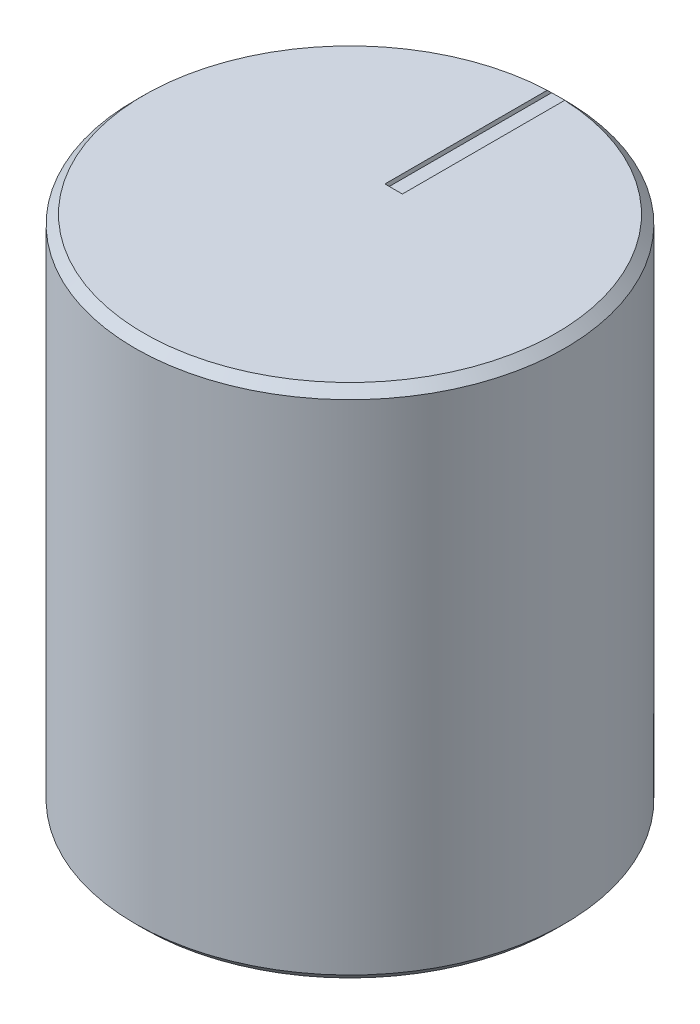
ISO-10303-21;
HEADER;
FILE_DESCRIPTION(('STEP AP214'),'2;1');
FILE_NAME('part.step','',(''),(''),'','','');
FILE_SCHEMA(('AUTOMOTIVE_DESIGN { 1 0 10303 214 1 1 1 1 }'));
ENDSEC;
DATA;
#1=APPLICATION_CONTEXT('core data for automotive mechanical design processes');
#2=APPLICATION_PROTOCOL_DEFINITION('international standard','automotive_design',2000,#1);
#3=PRODUCT_CONTEXT('',#1,'mechanical');
#4=PRODUCT('Part','Part','',(#3));
#5=PRODUCT_RELATED_PRODUCT_CATEGORY('part','',(#4));
#6=PRODUCT_DEFINITION_FORMATION('','',#4);
#7=PRODUCT_DEFINITION_CONTEXT('part definition',#1,'design');
#8=PRODUCT_DEFINITION('design','',#6,#7);
#9=PRODUCT_DEFINITION_SHAPE('','',#8);
#10=(LENGTH_UNIT() NAMED_UNIT(*) SI_UNIT(.MILLI.,.METRE.));
#11=(NAMED_UNIT(*) PLANE_ANGLE_UNIT() SI_UNIT($,.RADIAN.));
#12=(NAMED_UNIT(*) SI_UNIT($,.STERADIAN.) SOLID_ANGLE_UNIT());
#13=UNCERTAINTY_MEASURE_WITH_UNIT(LENGTH_MEASURE(1.E-05),#10,'distance_accuracy_value','');
#14=(GEOMETRIC_REPRESENTATION_CONTEXT(3) GLOBAL_UNCERTAINTY_ASSIGNED_CONTEXT((#13)) GLOBAL_UNIT_ASSIGNED_CONTEXT((#10,
#11,#12)) REPRESENTATION_CONTEXT('',''));
#15=CARTESIAN_POINT('',(0.,0.,0.));
#16=DIRECTION('',(0.,0.,1.));
#17=DIRECTION('',(1.,0.,0.));
#18=AXIS2_PLACEMENT_3D('',#15,#16,#17);
#19=CARTESIAN_POINT('',(0.,15.,0.));
#20=DIRECTION('',(0.,-1.,0.));
#21=DIRECTION('',(0.,0.,-1.));
#22=AXIS2_PLACEMENT_3D('',#19,#20,#21);
#23=CYLINDRICAL_SURFACE('',#22,6.25);
#24=CARTESIAN_POINT('',(0.,14.746,0.));
#25=DIRECTION('',(0.,1.,0.));
#26=DIRECTION('',(0.,0.,1.));
#27=AXIS2_PLACEMENT_3D('',#24,#25,#26);
#28=CIRCLE('',#27,6.25);
#29=CARTESIAN_POINT('',(0.,14.746,6.25));
#30=VERTEX_POINT('',#29);
#31=EDGE_CURVE('E111',#30,#30,#28,.F.);
#32=ORIENTED_EDGE('',*,*,#31,.T.);
#33=EDGE_LOOP('',(#32));
#34=FACE_BOUND('',#33,.T.);
#35=CARTESIAN_POINT('',(0.,0.253999999999997,0.));
#36=DIRECTION('',(0.,1.,0.));
#37=DIRECTION('',(0.,0.,1.));
#38=AXIS2_PLACEMENT_3D('',#35,#36,#37);
#39=CIRCLE('',#38,6.25);
#40=CARTESIAN_POINT('',(0.,0.253999999999997,6.25));
#41=VERTEX_POINT('',#40);
#42=EDGE_CURVE('E108',#41,#41,#39,.T.);
#43=ORIENTED_EDGE('',*,*,#42,.T.);
#44=EDGE_LOOP('',(#43));
#45=FACE_BOUND('',#44,.T.);
#46=ADVANCED_FACE('F35',(#34,#45),#23,.T.);
#47=CARTESIAN_POINT('',(0.,15.,0.));
#48=DIRECTION('',(0.,1.,0.));
#49=DIRECTION('',(0.,0.,1.));
#50=AXIS2_PLACEMENT_3D('',#47,#48,#49);
#51=PLANE('',#50);
#52=DIRECTION('',(0.,0.,1.));
#53=VECTOR('',#52,1.);
#54=CARTESIAN_POINT('',(-0.254,15.,-6.21376467680139));
#55=LINE('',#54,#53);
#56=CARTESIAN_POINT('',(-0.254,15.,-5.99061766431475));
#57=VERTEX_POINT('',#56);
#58=CARTESIAN_POINT('',(-0.253999999999999,15.,-1.27));
#59=VERTEX_POINT('',#58);
#60=EDGE_CURVE('E89',#57,#59,#55,.T.);
#61=ORIENTED_EDGE('',*,*,#60,.F.);
#62=CARTESIAN_POINT('',(0.,15.,0.));
#63=DIRECTION('',(0.,1.,0.));
#64=DIRECTION('',(0.,0.,1.));
#65=AXIS2_PLACEMENT_3D('',#62,#63,#64);
#66=CIRCLE('',#65,5.99599999999999);
#67=CARTESIAN_POINT('',(0.254,15.,-5.99061766431475));
#68=VERTEX_POINT('',#67);
#69=EDGE_CURVE('E103',#57,#68,#66,.T.);
#70=ORIENTED_EDGE('',*,*,#69,.T.);
#71=DIRECTION('',(0.,0.,-1.));
#72=VECTOR('',#71,1.);
#73=CARTESIAN_POINT('',(0.254,15.,-6.21376467680139));
#74=LINE('',#73,#72);
#75=CARTESIAN_POINT('',(0.253999999999999,15.,-1.27));
#76=VERTEX_POINT('',#75);
#77=EDGE_CURVE('E83',#76,#68,#74,.T.);
#78=ORIENTED_EDGE('',*,*,#77,.F.);
#79=DIRECTION('',(1.,0.,0.));
#80=VECTOR('',#79,1.);
#81=CARTESIAN_POINT('',(-0.253999999999999,15.,-1.27));
#82=LINE('',#81,#80);
#83=EDGE_CURVE('E100',#59,#76,#82,.T.);
#84=ORIENTED_EDGE('',*,*,#83,.F.);
#85=EDGE_LOOP('',(#61,#70,#78,#84));
#86=FACE_BOUND('',#85,.T.);
#87=ADVANCED_FACE('F135',(#86),#51,.T.);
#88=CARTESIAN_POINT('',(0.,0.,0.));
#89=DIRECTION('',(0.,1.,0.));
#90=DIRECTION('',(0.,0.,1.));
#91=AXIS2_PLACEMENT_3D('',#88,#89,#90);
#92=PLANE('',#91);
#93=CARTESIAN_POINT('',(0.,0.,0.));
#94=DIRECTION('',(0.,1.,0.));
#95=DIRECTION('',(0.,0.,1.));
#96=AXIS2_PLACEMENT_3D('',#93,#94,#95);
#97=CIRCLE('',#96,5.996);
#98=CARTESIAN_POINT('',(0.,0.,5.996));
#99=VERTEX_POINT('',#98);
#100=EDGE_CURVE('E115',#99,#99,#97,.F.);
#101=ORIENTED_EDGE('',*,*,#100,.T.);
#102=EDGE_LOOP('',(#101));
#103=FACE_BOUND('',#102,.T.);
#104=ADVANCED_FACE('F138',(#103),#92,.F.);
#105=CARTESIAN_POINT('',(0.,15.,0.));
#106=DIRECTION('',(0.,-1.,0.));
#107=DIRECTION('',(0.,0.,-1.));
#108=AXIS2_PLACEMENT_3D('',#105,#106,#107);
#109=CONICAL_SURFACE('',#108,5.99599999999999,0.785398163397445);
#110=CARTESIAN_POINT('',(-0.254000000000001,10.3369813095631,-10.6559919032947));
#111=CARTESIAN_POINT('',(-0.254000000000001,10.739421987055,-10.2534356678842));
#112=CARTESIAN_POINT('',(-0.254,11.1418573654115,-9.85087413434728));
#113=CARTESIAN_POINT('',(-0.254,11.9467090007975,-9.04573241675473));
#114=CARTESIAN_POINT('',(-0.254,12.3491252578378,-8.64315223270999));
#115=CARTESIAN_POINT('',(-0.254,13.153929949048,-7.83796533853271));
#116=CARTESIAN_POINT('',(-0.254,13.5563183832613,-7.43535862844354));
#117=CARTESIAN_POINT('',(-0.254,14.3610513824401,-6.63010091727617));
#118=CARTESIAN_POINT('',(-0.254,14.7633959473809,-6.2274499161733));
#119=CARTESIAN_POINT('',(-0.254,15.5680114430235,-5.42207179104844));
#120=CARTESIAN_POINT('',(-0.254,15.9702823734881,-5.01934466678953));
#121=CARTESIAN_POINT('',(-0.254,16.5735735323527,-4.41513964442077));
#122=CARTESIAN_POINT('',(-0.254,16.7746511966832,-4.21371909720213));
#123=CARTESIAN_POINT('',(-0.254,17.1767474166563,-3.81081868756715));
#124=CARTESIAN_POINT('',(-0.254,17.3777659722523,-3.60933882510439));
#125=CARTESIAN_POINT('',(-0.254,17.7797078514177,-3.20628176695699));
#126=CARTESIAN_POINT('',(-0.254,17.9806311744198,-3.00470457070678));
#127=CARTESIAN_POINT('',(-0.254,18.3823105245483,-2.60138438300414));
#128=CARTESIAN_POINT('',(-0.254,18.5830665520595,-2.39964139193534));
#129=CARTESIAN_POINT('',(-0.254,18.8839380800074,-2.0967641066331));
#130=CARTESIAN_POINT('',(-0.253999999999999,18.9841853214257,-1.99576072249854));
#131=CARTESIAN_POINT('',(-0.253999999999999,19.1845393893087,-1.79361520733663));
#132=CARTESIAN_POINT('',(-0.253999999999999,19.2846462160896,-1.69247307662263));
#133=CARTESIAN_POINT('',(-0.253999999999999,19.484630556733,-1.4899601118495));
#134=CARTESIAN_POINT('',(-0.253999999999999,19.5845080683389,-1.38858927555893));
#135=CARTESIAN_POINT('',(-0.253999999999999,19.7340000581108,-1.23621383378888));
#136=CARTESIAN_POINT('',(-0.253999999999999,19.7837768667688,-1.18536862493252));
#137=CARTESIAN_POINT('',(-0.253999999999999,19.8831641408086,-1.08351553215591));
#138=CARTESIAN_POINT('',(-0.253999999999999,19.9327746054859,-1.03250764754842));
#139=CARTESIAN_POINT('',(-0.253999999999999,19.9822726268755,-0.981390435566857));
#140=B_SPLINE_CURVE_WITH_KNOTS('',3,(#110,#111,#112,#113,#114,#115,#116,#117,#118,#119,#120,
#121,#122,#123,#124,#125,#126,#127,#128,#129,#130,#131,#132,#133,#134,#135,#136,#137,#138,#139),
.UNSPECIFIED.,.F.,.F.,(4,2,2,2,2,2,2,2,2,2,2,2,2,2,4),(0.,1.70765634586201,3.41531170770028,
5.12296434379059,6.83061793593988,8.53827693316711,9.39210488157586,10.2459334996874,
11.0997671402823,11.9535988107468,12.3805187765435,12.8074377797723,13.2343609665454,
13.4478242092593,13.6612883549744),.UNSPECIFIED.);
#141=CARTESIAN_POINT('',(-0.254,14.873,-6.11772939904994));
#142=VERTEX_POINT('',#141);
#143=EDGE_CURVE('E11',#142,#57,#140,.T.);
#144=ORIENTED_EDGE('',*,*,#143,.F.);
#145=CARTESIAN_POINT('',(0.,14.873,0.));
#146=DIRECTION('',(0.,1.,0.));
#147=DIRECTION('',(0.,0.,1.));
#148=AXIS2_PLACEMENT_3D('',#145,#146,#147);
#149=CIRCLE('',#148,6.12299999999999);
#150=CARTESIAN_POINT('',(0.254,14.873,-6.11772939904994));
#151=VERTEX_POINT('',#150);
#152=EDGE_CURVE('E59',#142,#151,#149,.F.);
#153=ORIENTED_EDGE('',*,*,#152,.T.);
#154=CARTESIAN_POINT('',(0.253999999999999,19.9822726268755,-0.981390435566857));
#155=CARTESIAN_POINT('',(0.253999999999999,19.9134110288118,-1.05248408349036));
#156=CARTESIAN_POINT('',(0.253999999999999,19.8443477370952,-1.12338122642925));
#157=CARTESIAN_POINT('',(0.253999999999999,19.7059409254085,-1.26490063628882));
#158=CARTESIAN_POINT('',(0.253999999999999,19.6365974074031,-1.33552290512982));
#159=CARTESIAN_POINT('',(0.253999999999999,19.428330943697,-1.54715492266712));
#160=CARTESIAN_POINT('',(0.253999999999999,19.2891709484143,-1.68793105112613));
#161=CARTESIAN_POINT('',(0.254,18.8712839556621,-2.10984151676619));
#162=CARTESIAN_POINT('',(0.254,18.5921428583856,-2.39056515189938));
#163=CARTESIAN_POINT('',(0.254,18.0335201474699,-2.95167302464992));
#164=CARTESIAN_POINT('',(0.254,17.7540385336901,-3.23205726212701));
#165=CARTESIAN_POINT('',(0.254,17.1949018586691,-3.79265801124779));
#166=CARTESIAN_POINT('',(0.254,16.9152467958404,-4.07287452130864));
#167=CARTESIAN_POINT('',(0.254,16.3558497978396,-4.6332205977661));
#168=CARTESIAN_POINT('',(0.254,16.0761078626948,-4.91335016418998));
#169=CARTESIAN_POINT('',(0.254,15.691239931008,-5.2986781202374));
#170=CARTESIAN_POINT('',(0.254,15.5861368088369,-5.40389935337185));
#171=CARTESIAN_POINT('',(0.254,15.3759242710248,-5.61433501434843));
#172=CARTESIAN_POINT('',(0.254,15.2708148554,-5.71954944220668));
#173=CARTESIAN_POINT('',(0.254,14.3610954879967,-6.63013646686346));
#174=CARTESIAN_POINT('',(0.254,13.5563483856896,-7.43537203454011));
#175=CARTESIAN_POINT('',(0.254,11.9467222934051,-9.04573005716789));
#176=CARTESIAN_POINT('',(0.254,11.1418433020037,-9.85085251069565));
#177=CARTESIAN_POINT('',(0.254000000000001,10.3369813095631,-10.6559919032947));
#178=B_SPLINE_CURVE_WITH_KNOTS('',3,(#154,#155,#156,#157,#158,#159,#160,#161,#162,#163,#164,
#165,#166,#167,#168,#169,#170,#171,#172,#173,#174,#175,#176,#177),.UNSPECIFIED.,.F.,.F.,(4,2,2,
2,2,2,2,2,2,2,2,4),(0.,0.296926101900582,0.593850125679893,1.18769327555862,2.37534921714036,
3.56300564936403,4.7506731181667,5.93834021408457,6.38450561724111,6.83066992054013,
10.2459590388548,13.6612878498678),.UNSPECIFIED.);
#179=EDGE_CURVE('E47',#68,#151,#178,.T.);
#180=ORIENTED_EDGE('',*,*,#179,.F.);
#181=ORIENTED_EDGE('',*,*,#69,.F.);
#182=EDGE_LOOP('',(#144,#153,#180,#181));
#183=FACE_BOUND('',#182,.T.);
#184=ORIENTED_EDGE('',*,*,#31,.F.);
#185=EDGE_LOOP('',(#184));
#186=FACE_BOUND('',#185,.T.);
#187=ADVANCED_FACE('F122',(#183,#186),#109,.T.);
#188=CARTESIAN_POINT('',(0.,0.253999999999997,0.));
#189=DIRECTION('',(0.,1.,0.));
#190=DIRECTION('',(0.,0.,1.));
#191=AXIS2_PLACEMENT_3D('',#188,#189,#190);
#192=CONICAL_SURFACE('',#191,6.25,0.785398163397445);
#193=ORIENTED_EDGE('',*,*,#100,.F.);
#194=EDGE_LOOP('',(#193));
#195=FACE_BOUND('',#194,.T.);
#196=ORIENTED_EDGE('',*,*,#42,.F.);
#197=EDGE_LOOP('',(#196));
#198=FACE_BOUND('',#197,.T.);
#199=ADVANCED_FACE('F37',(#195,#198),#192,.T.);
#200=CARTESIAN_POINT('',(-0.254,14.873,-6.21376467680139));
#201=DIRECTION('',(-1.,0.,0.));
#202=DIRECTION('',(0.,0.,1.));
#203=AXIS2_PLACEMENT_3D('',#200,#201,#202);
#204=PLANE('',#203);
#205=ORIENTED_EDGE('',*,*,#143,.T.);
#206=ORIENTED_EDGE('',*,*,#60,.T.);
#207=DIRECTION('',(0.,1.,0.));
#208=VECTOR('',#207,1.);
#209=CARTESIAN_POINT('',(-0.253999999999999,14.873,-1.27));
#210=LINE('',#209,#208);
#211=CARTESIAN_POINT('',(-0.253999999999999,14.873,-1.27));
#212=VERTEX_POINT('',#211);
#213=EDGE_CURVE('E86',#212,#59,#210,.T.);
#214=ORIENTED_EDGE('',*,*,#213,.F.);
#215=DIRECTION('',(0.,0.,1.));
#216=VECTOR('',#215,1.);
#217=CARTESIAN_POINT('',(-0.254,14.873,-6.21376467680139));
#218=LINE('',#217,#216);
#219=EDGE_CURVE('E76',#142,#212,#218,.T.);
#220=ORIENTED_EDGE('',*,*,#219,.F.);
#221=EDGE_LOOP('',(#205,#206,#214,#220));
#222=FACE_BOUND('',#221,.T.);
#223=ADVANCED_FACE('F87',(#222),#204,.F.);
#224=CARTESIAN_POINT('',(0.254,14.873,-6.21376467680139));
#225=DIRECTION('',(1.,0.,0.));
#226=DIRECTION('',(0.,0.,-1.));
#227=AXIS2_PLACEMENT_3D('',#224,#225,#226);
#228=PLANE('',#227);
#229=ORIENTED_EDGE('',*,*,#179,.T.);
#230=DIRECTION('',(0.,0.,-1.));
#231=VECTOR('',#230,1.);
#232=CARTESIAN_POINT('',(0.254,14.873,-6.21376467680139));
#233=LINE('',#232,#231);
#234=CARTESIAN_POINT('',(0.253999999999999,14.873,-1.27));
#235=VERTEX_POINT('',#234);
#236=EDGE_CURVE('E54',#235,#151,#233,.T.);
#237=ORIENTED_EDGE('',*,*,#236,.F.);
#238=DIRECTION('',(0.,1.,0.));
#239=VECTOR('',#238,1.);
#240=CARTESIAN_POINT('',(0.253999999999999,14.873,-1.27));
#241=LINE('',#240,#239);
#242=EDGE_CURVE('E93',#235,#76,#241,.T.);
#243=ORIENTED_EDGE('',*,*,#242,.T.);
#244=ORIENTED_EDGE('',*,*,#77,.T.);
#245=EDGE_LOOP('',(#229,#237,#243,#244));
#246=FACE_BOUND('',#245,.T.);
#247=ADVANCED_FACE('F125',(#246),#228,.F.);
#248=CARTESIAN_POINT('',(-0.253999999999999,14.873,-1.27));
#249=DIRECTION('',(0.,0.,1.));
#250=DIRECTION('',(1.,0.,0.));
#251=AXIS2_PLACEMENT_3D('',#248,#249,#250);
#252=PLANE('',#251);
#253=ORIENTED_EDGE('',*,*,#83,.T.);
#254=ORIENTED_EDGE('',*,*,#242,.F.);
#255=DIRECTION('',(1.,0.,0.));
#256=VECTOR('',#255,1.);
#257=CARTESIAN_POINT('',(-0.253999999999999,14.873,-1.27));
#258=LINE('',#257,#256);
#259=EDGE_CURVE('E80',#212,#235,#258,.T.);
#260=ORIENTED_EDGE('',*,*,#259,.F.);
#261=ORIENTED_EDGE('',*,*,#213,.T.);
#262=EDGE_LOOP('',(#253,#254,#260,#261));
#263=FACE_BOUND('',#262,.T.);
#264=ADVANCED_FACE('F95',(#263),#252,.F.);
#265=CARTESIAN_POINT('',(0.,14.873,0.));
#266=DIRECTION('',(0.,1.,0.));
#267=DIRECTION('',(0.,0.,1.));
#268=AXIS2_PLACEMENT_3D('',#265,#266,#267);
#269=PLANE('',#268);
#270=ORIENTED_EDGE('',*,*,#219,.T.);
#271=ORIENTED_EDGE('',*,*,#259,.T.);
#272=ORIENTED_EDGE('',*,*,#236,.T.);
#273=ORIENTED_EDGE('',*,*,#152,.F.);
#274=EDGE_LOOP('',(#270,#271,#272,#273));
#275=FACE_BOUND('',#274,.T.);
#276=ADVANCED_FACE('F78',(#275),#269,.T.);
#277=CLOSED_SHELL('',(#46,#87,#104,#187,#199,#223,#247,#264,#276));
#278=MANIFOLD_SOLID_BREP('B2',#277);
#279=ADVANCED_BREP_SHAPE_REPRESENTATION('',(#18,#278),#14);
#280=SHAPE_DEFINITION_REPRESENTATION(#9,#279);
ENDSEC;
END-ISO-10303-21;
